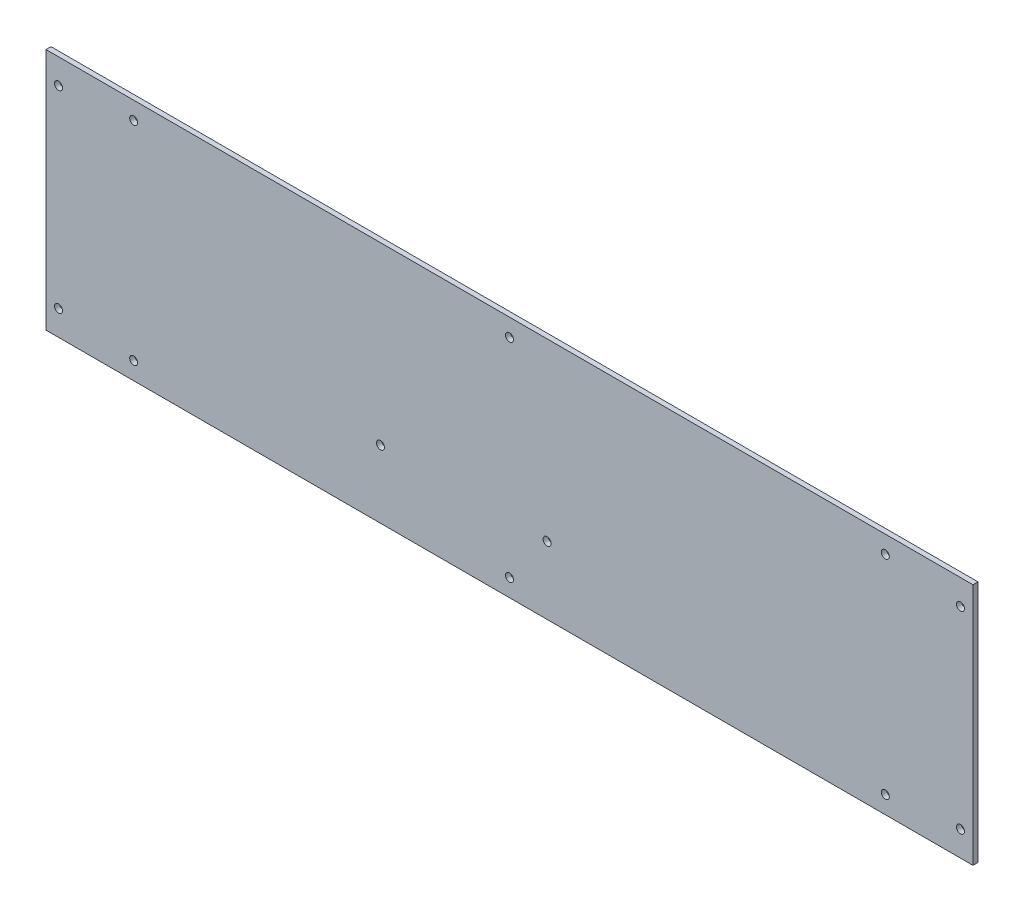
ISO-10303-21;
HEADER;
FILE_DESCRIPTION(('STEP AP214'),'2;1');
FILE_NAME('part.step','',(''),(''),'','','');
FILE_SCHEMA(('AUTOMOTIVE_DESIGN { 1 0 10303 214 1 1 1 1 }'));
ENDSEC;
DATA;
#1=APPLICATION_CONTEXT('core data for automotive mechanical design processes');
#2=APPLICATION_PROTOCOL_DEFINITION('international standard','automotive_design',2000,#1);
#3=PRODUCT_CONTEXT('',#1,'mechanical');
#4=PRODUCT('Part','Part','',(#3));
#5=PRODUCT_RELATED_PRODUCT_CATEGORY('part','',(#4));
#6=PRODUCT_DEFINITION_FORMATION('','',#4);
#7=PRODUCT_DEFINITION_CONTEXT('part definition',#1,'design');
#8=PRODUCT_DEFINITION('design','',#6,#7);
#9=PRODUCT_DEFINITION_SHAPE('','',#8);
#10=(LENGTH_UNIT() NAMED_UNIT(*) SI_UNIT(.MILLI.,.METRE.));
#11=(NAMED_UNIT(*) PLANE_ANGLE_UNIT() SI_UNIT($,.RADIAN.));
#12=(NAMED_UNIT(*) SI_UNIT($,.STERADIAN.) SOLID_ANGLE_UNIT());
#13=UNCERTAINTY_MEASURE_WITH_UNIT(LENGTH_MEASURE(1.E-05),#10,'distance_accuracy_value','');
#14=(GEOMETRIC_REPRESENTATION_CONTEXT(3) GLOBAL_UNCERTAINTY_ASSIGNED_CONTEXT((#13)) GLOBAL_UNIT_ASSIGNED_CONTEXT((#10,
#11,#12)) REPRESENTATION_CONTEXT('',''));
#15=CARTESIAN_POINT('',(0.,0.,0.));
#16=DIRECTION('',(0.,0.,1.));
#17=DIRECTION('',(1.,0.,0.));
#18=AXIS2_PLACEMENT_3D('',#15,#16,#17);
#19=CARTESIAN_POINT('',(0.,0.,-2.));
#20=DIRECTION('',(0.,-1.,0.));
#21=DIRECTION('',(0.,0.,-1.));
#22=AXIS2_PLACEMENT_3D('',#19,#20,#21);
#23=PLANE('',#22);
#24=DIRECTION('',(1.,0.,0.));
#25=VECTOR('',#24,1.);
#26=CARTESIAN_POINT('',(0.,0.,0.));
#27=LINE('',#26,#25);
#28=CARTESIAN_POINT('',(-370.,0.,0.));
#29=VERTEX_POINT('',#28);
#30=CARTESIAN_POINT('',(0.,0.,0.));
#31=VERTEX_POINT('',#30);
#32=EDGE_CURVE('E107',#29,#31,#27,.T.);
#33=ORIENTED_EDGE('',*,*,#32,.F.);
#34=DIRECTION('',(0.,0.,1.));
#35=VECTOR('',#34,1.);
#36=CARTESIAN_POINT('',(-370.,0.,-2.));
#37=LINE('',#36,#35);
#38=CARTESIAN_POINT('',(-370.,0.,-2.));
#39=VERTEX_POINT('',#38);
#40=EDGE_CURVE('E11',#39,#29,#37,.T.);
#41=ORIENTED_EDGE('',*,*,#40,.F.);
#42=DIRECTION('',(1.,0.,0.));
#43=VECTOR('',#42,1.);
#44=CARTESIAN_POINT('',(0.,0.,-2.));
#45=LINE('',#44,#43);
#46=CARTESIAN_POINT('',(0.,0.,-2.));
#47=VERTEX_POINT('',#46);
#48=EDGE_CURVE('E101',#39,#47,#45,.T.);
#49=ORIENTED_EDGE('',*,*,#48,.T.);
#50=DIRECTION('',(0.,0.,1.));
#51=VECTOR('',#50,1.);
#52=CARTESIAN_POINT('',(0.,0.,-2.));
#53=LINE('',#52,#51);
#54=EDGE_CURVE('E46',#47,#31,#53,.T.);
#55=ORIENTED_EDGE('',*,*,#54,.T.);
#56=EDGE_LOOP('',(#33,#41,#49,#55));
#57=FACE_BOUND('',#56,.T.);
#58=ADVANCED_FACE('F43',(#57),#23,.T.);
#59=CARTESIAN_POINT('',(-370.,0.,-2.));
#60=DIRECTION('',(-1.,0.,0.));
#61=DIRECTION('',(0.,0.,1.));
#62=AXIS2_PLACEMENT_3D('',#59,#60,#61);
#63=PLANE('',#62);
#64=DIRECTION('',(0.,-1.,0.));
#65=VECTOR('',#64,1.);
#66=CARTESIAN_POINT('',(-370.,0.,0.));
#67=LINE('',#66,#65);
#68=CARTESIAN_POINT('',(-370.,97.,0.));
#69=VERTEX_POINT('',#68);
#70=EDGE_CURVE('E103',#69,#29,#67,.T.);
#71=ORIENTED_EDGE('',*,*,#70,.F.);
#72=DIRECTION('',(0.,0.,1.));
#73=VECTOR('',#72,1.);
#74=CARTESIAN_POINT('',(-370.,97.,-2.));
#75=LINE('',#74,#73);
#76=CARTESIAN_POINT('',(-370.,97.,-2.));
#77=VERTEX_POINT('',#76);
#78=EDGE_CURVE('E55',#77,#69,#75,.T.);
#79=ORIENTED_EDGE('',*,*,#78,.F.);
#80=DIRECTION('',(0.,-1.,0.));
#81=VECTOR('',#80,1.);
#82=CARTESIAN_POINT('',(-370.,0.,-2.));
#83=LINE('',#82,#81);
#84=EDGE_CURVE('E98',#77,#39,#83,.T.);
#85=ORIENTED_EDGE('',*,*,#84,.T.);
#86=ORIENTED_EDGE('',*,*,#40,.T.);
#87=EDGE_LOOP('',(#71,#79,#85,#86));
#88=FACE_BOUND('',#87,.T.);
#89=ADVANCED_FACE('F116',(#88),#63,.T.);
#90=CARTESIAN_POINT('',(0.,97.,-2.));
#91=DIRECTION('',(0.,1.,0.));
#92=DIRECTION('',(0.,0.,1.));
#93=AXIS2_PLACEMENT_3D('',#90,#91,#92);
#94=PLANE('',#93);
#95=DIRECTION('',(-1.,0.,0.));
#96=VECTOR('',#95,1.);
#97=CARTESIAN_POINT('',(0.,97.,0.));
#98=LINE('',#97,#96);
#99=CARTESIAN_POINT('',(0.,97.,0.));
#100=VERTEX_POINT('',#99);
#101=EDGE_CURVE('E91',#100,#69,#98,.T.);
#102=ORIENTED_EDGE('',*,*,#101,.F.);
#103=DIRECTION('',(0.,0.,1.));
#104=VECTOR('',#103,1.);
#105=CARTESIAN_POINT('',(0.,97.,-2.));
#106=LINE('',#105,#104);
#107=CARTESIAN_POINT('',(0.,97.,-2.));
#108=VERTEX_POINT('',#107);
#109=EDGE_CURVE('E86',#108,#100,#106,.T.);
#110=ORIENTED_EDGE('',*,*,#109,.F.);
#111=DIRECTION('',(-1.,0.,0.));
#112=VECTOR('',#111,1.);
#113=CARTESIAN_POINT('',(0.,97.,-2.));
#114=LINE('',#113,#112);
#115=EDGE_CURVE('E93',#108,#77,#114,.T.);
#116=ORIENTED_EDGE('',*,*,#115,.T.);
#117=ORIENTED_EDGE('',*,*,#78,.T.);
#118=EDGE_LOOP('',(#102,#110,#116,#117));
#119=FACE_BOUND('',#118,.T.);
#120=ADVANCED_FACE('F89',(#119),#94,.T.);
#121=CARTESIAN_POINT('',(0.,0.,-2.));
#122=DIRECTION('',(1.,0.,0.));
#123=DIRECTION('',(0.,0.,-1.));
#124=AXIS2_PLACEMENT_3D('',#121,#122,#123);
#125=PLANE('',#124);
#126=DIRECTION('',(0.,1.,0.));
#127=VECTOR('',#126,1.);
#128=CARTESIAN_POINT('',(0.,0.,0.));
#129=LINE('',#128,#127);
#130=EDGE_CURVE('E112',#31,#100,#129,.T.);
#131=ORIENTED_EDGE('',*,*,#130,.F.);
#132=ORIENTED_EDGE('',*,*,#54,.F.);
#133=DIRECTION('',(0.,1.,0.));
#134=VECTOR('',#133,1.);
#135=CARTESIAN_POINT('',(0.,0.,-2.));
#136=LINE('',#135,#134);
#137=EDGE_CURVE('E100',#47,#108,#136,.T.);
#138=ORIENTED_EDGE('',*,*,#137,.T.);
#139=ORIENTED_EDGE('',*,*,#109,.T.);
#140=EDGE_LOOP('',(#131,#132,#138,#139));
#141=FACE_BOUND('',#140,.T.);
#142=ADVANCED_FACE('F99',(#141),#125,.T.);
#143=CARTESIAN_POINT('',(0.,0.,-2.));
#144=DIRECTION('',(0.,0.,-1.));
#145=DIRECTION('',(-1.,0.,0.));
#146=AXIS2_PLACEMENT_3D('',#143,#144,#145);
#147=PLANE('',#146);
#148=CARTESIAN_POINT('',(-35.,7.00000000000001,-2.));
#149=DIRECTION('',(0.,0.,1.));
#150=DIRECTION('',(1.,0.,0.));
#151=AXIS2_PLACEMENT_3D('',#148,#149,#150);
#152=CIRCLE('',#151,1.6);
#153=CARTESIAN_POINT('',(-33.4,7.00000000000001,-2.));
#154=VERTEX_POINT('',#153);
#155=EDGE_CURVE('E195',#154,#154,#152,.T.);
#156=ORIENTED_EDGE('',*,*,#155,.T.);
#157=EDGE_LOOP('',(#156));
#158=FACE_BOUND('',#157,.T.);
#159=CARTESIAN_POINT('',(-335.,7.00000000000001,-2.));
#160=DIRECTION('',(0.,0.,1.));
#161=DIRECTION('',(1.,0.,0.));
#162=AXIS2_PLACEMENT_3D('',#159,#160,#161);
#163=CIRCLE('',#162,1.59999999999999);
#164=CARTESIAN_POINT('',(-333.4,7.00000000000001,-2.));
#165=VERTEX_POINT('',#164);
#166=EDGE_CURVE('E199',#165,#165,#163,.T.);
#167=ORIENTED_EDGE('',*,*,#166,.T.);
#168=EDGE_LOOP('',(#167));
#169=FACE_BOUND('',#168,.T.);
#170=CARTESIAN_POINT('',(-185.,7.,-2.));
#171=DIRECTION('',(0.,0.,1.));
#172=DIRECTION('',(1.,0.,0.));
#173=AXIS2_PLACEMENT_3D('',#170,#171,#172);
#174=CIRCLE('',#173,1.59999999999999);
#175=CARTESIAN_POINT('',(-183.4,7.,-2.));
#176=VERTEX_POINT('',#175);
#177=EDGE_CURVE('E206',#176,#176,#174,.T.);
#178=ORIENTED_EDGE('',*,*,#177,.T.);
#179=EDGE_LOOP('',(#178));
#180=FACE_BOUND('',#179,.T.);
#181=CARTESIAN_POINT('',(-170.,27.,-2.));
#182=DIRECTION('',(0.,0.,1.));
#183=DIRECTION('',(1.,0.,0.));
#184=AXIS2_PLACEMENT_3D('',#181,#182,#183);
#185=CIRCLE('',#184,1.59999999999999);
#186=CARTESIAN_POINT('',(-168.4,27.,-2.));
#187=VERTEX_POINT('',#186);
#188=EDGE_CURVE('E215',#187,#187,#185,.T.);
#189=ORIENTED_EDGE('',*,*,#188,.T.);
#190=EDGE_LOOP('',(#189));
#191=FACE_BOUND('',#190,.T.);
#192=CARTESIAN_POINT('',(-236.5,27.,-2.));
#193=DIRECTION('',(0.,0.,1.));
#194=DIRECTION('',(1.,0.,0.));
#195=AXIS2_PLACEMENT_3D('',#192,#193,#194);
#196=CIRCLE('',#195,1.59999999999999);
#197=CARTESIAN_POINT('',(-234.9,27.,-2.));
#198=VERTEX_POINT('',#197);
#199=EDGE_CURVE('E217',#198,#198,#196,.T.);
#200=ORIENTED_EDGE('',*,*,#199,.T.);
#201=EDGE_LOOP('',(#200));
#202=FACE_BOUND('',#201,.T.);
#203=CARTESIAN_POINT('',(-185.,90.,-2.));
#204=DIRECTION('',(0.,0.,1.));
#205=DIRECTION('',(1.,0.,0.));
#206=AXIS2_PLACEMENT_3D('',#203,#204,#205);
#207=CIRCLE('',#206,1.6);
#208=CARTESIAN_POINT('',(-183.4,90.,-2.));
#209=VERTEX_POINT('',#208);
#210=EDGE_CURVE('E221',#209,#209,#207,.T.);
#211=ORIENTED_EDGE('',*,*,#210,.T.);
#212=EDGE_LOOP('',(#211));
#213=FACE_BOUND('',#212,.T.);
#214=CARTESIAN_POINT('',(-335.,90.,-2.));
#215=DIRECTION('',(0.,0.,1.));
#216=DIRECTION('',(1.,0.,0.));
#217=AXIS2_PLACEMENT_3D('',#214,#215,#216);
#218=CIRCLE('',#217,1.6);
#219=CARTESIAN_POINT('',(-333.4,90.,-2.));
#220=VERTEX_POINT('',#219);
#221=EDGE_CURVE('E228',#220,#220,#218,.T.);
#222=ORIENTED_EDGE('',*,*,#221,.T.);
#223=EDGE_LOOP('',(#222));
#224=FACE_BOUND('',#223,.T.);
#225=CARTESIAN_POINT('',(-35.,90.,-2.));
#226=DIRECTION('',(0.,0.,1.));
#227=DIRECTION('',(1.,0.,0.));
#228=AXIS2_PLACEMENT_3D('',#225,#226,#227);
#229=CIRCLE('',#228,1.60000000000001);
#230=CARTESIAN_POINT('',(-33.4,90.,-2.));
#231=VERTEX_POINT('',#230);
#232=EDGE_CURVE('E237',#231,#231,#229,.T.);
#233=ORIENTED_EDGE('',*,*,#232,.T.);
#234=EDGE_LOOP('',(#233));
#235=FACE_BOUND('',#234,.T.);
#236=CARTESIAN_POINT('',(-365.,87.,-2.));
#237=DIRECTION('',(0.,0.,1.));
#238=DIRECTION('',(1.,0.,0.));
#239=AXIS2_PLACEMENT_3D('',#236,#237,#238);
#240=CIRCLE('',#239,1.59999999999999);
#241=CARTESIAN_POINT('',(-363.4,87.,-2.));
#242=VERTEX_POINT('',#241);
#243=EDGE_CURVE('E245',#242,#242,#240,.T.);
#244=ORIENTED_EDGE('',*,*,#243,.T.);
#245=EDGE_LOOP('',(#244));
#246=FACE_BOUND('',#245,.T.);
#247=CARTESIAN_POINT('',(-365.,10.,-2.));
#248=DIRECTION('',(0.,0.,1.));
#249=DIRECTION('',(1.,0.,0.));
#250=AXIS2_PLACEMENT_3D('',#247,#248,#249);
#251=CIRCLE('',#250,1.59999999999999);
#252=CARTESIAN_POINT('',(-363.4,10.,-2.));
#253=VERTEX_POINT('',#252);
#254=EDGE_CURVE('E248',#253,#253,#251,.T.);
#255=ORIENTED_EDGE('',*,*,#254,.T.);
#256=EDGE_LOOP('',(#255));
#257=FACE_BOUND('',#256,.T.);
#258=CARTESIAN_POINT('',(-5.,87.,-2.));
#259=DIRECTION('',(0.,0.,1.));
#260=DIRECTION('',(1.,0.,0.));
#261=AXIS2_PLACEMENT_3D('',#258,#259,#260);
#262=CIRCLE('',#261,1.59999999999999);
#263=CARTESIAN_POINT('',(-3.40000000000001,87.,-2.));
#264=VERTEX_POINT('',#263);
#265=EDGE_CURVE('E255',#264,#264,#262,.T.);
#266=ORIENTED_EDGE('',*,*,#265,.T.);
#267=EDGE_LOOP('',(#266));
#268=FACE_BOUND('',#267,.T.);
#269=CARTESIAN_POINT('',(-5.,9.99999999999999,-2.));
#270=DIRECTION('',(0.,0.,1.));
#271=DIRECTION('',(1.,0.,0.));
#272=AXIS2_PLACEMENT_3D('',#269,#270,#271);
#273=CIRCLE('',#272,1.6);
#274=CARTESIAN_POINT('',(-3.4,9.99999999999999,-2.));
#275=VERTEX_POINT('',#274);
#276=EDGE_CURVE('E115',#275,#275,#273,.T.);
#277=ORIENTED_EDGE('',*,*,#276,.T.);
#278=EDGE_LOOP('',(#277));
#279=FACE_BOUND('',#278,.T.);
#280=ORIENTED_EDGE('',*,*,#48,.F.);
#281=ORIENTED_EDGE('',*,*,#84,.F.);
#282=ORIENTED_EDGE('',*,*,#115,.F.);
#283=ORIENTED_EDGE('',*,*,#137,.F.);
#284=EDGE_LOOP('',(#280,#281,#282,#283));
#285=FACE_BOUND('',#284,.T.);
#286=ADVANCED_FACE('F96',(#158,#169,#180,#191,#202,#213,#224,#235,#246,#257,#268,#279,#285),
#147,.T.);
#287=CARTESIAN_POINT('',(0.,0.,0.));
#288=DIRECTION('',(0.,0.,-1.));
#289=DIRECTION('',(-1.,0.,0.));
#290=AXIS2_PLACEMENT_3D('',#287,#288,#289);
#291=PLANE('',#290);
#292=CARTESIAN_POINT('',(-35.,7.00000000000001,0.));
#293=DIRECTION('',(0.,0.,1.));
#294=DIRECTION('',(1.,0.,0.));
#295=AXIS2_PLACEMENT_3D('',#292,#293,#294);
#296=CIRCLE('',#295,1.6);
#297=CARTESIAN_POINT('',(-33.4,7.00000000000001,0.));
#298=VERTEX_POINT('',#297);
#299=EDGE_CURVE('E194',#298,#298,#296,.T.);
#300=ORIENTED_EDGE('',*,*,#299,.F.);
#301=EDGE_LOOP('',(#300));
#302=FACE_BOUND('',#301,.T.);
#303=CARTESIAN_POINT('',(-335.,7.00000000000001,0.));
#304=DIRECTION('',(0.,0.,1.));
#305=DIRECTION('',(1.,0.,0.));
#306=AXIS2_PLACEMENT_3D('',#303,#304,#305);
#307=CIRCLE('',#306,1.59999999999999);
#308=CARTESIAN_POINT('',(-333.4,7.00000000000001,0.));
#309=VERTEX_POINT('',#308);
#310=EDGE_CURVE('E197',#309,#309,#307,.T.);
#311=ORIENTED_EDGE('',*,*,#310,.F.);
#312=EDGE_LOOP('',(#311));
#313=FACE_BOUND('',#312,.T.);
#314=CARTESIAN_POINT('',(-185.,7.,0.));
#315=DIRECTION('',(0.,0.,1.));
#316=DIRECTION('',(1.,0.,0.));
#317=AXIS2_PLACEMENT_3D('',#314,#315,#316);
#318=CIRCLE('',#317,1.59999999999999);
#319=CARTESIAN_POINT('',(-183.4,7.,0.));
#320=VERTEX_POINT('',#319);
#321=EDGE_CURVE('E201',#320,#320,#318,.T.);
#322=ORIENTED_EDGE('',*,*,#321,.F.);
#323=EDGE_LOOP('',(#322));
#324=FACE_BOUND('',#323,.T.);
#325=CARTESIAN_POINT('',(-170.,27.,0.));
#326=DIRECTION('',(0.,0.,1.));
#327=DIRECTION('',(1.,0.,0.));
#328=AXIS2_PLACEMENT_3D('',#325,#326,#327);
#329=CIRCLE('',#328,1.59999999999999);
#330=CARTESIAN_POINT('',(-168.4,27.,0.));
#331=VERTEX_POINT('',#330);
#332=EDGE_CURVE('E207',#331,#331,#329,.T.);
#333=ORIENTED_EDGE('',*,*,#332,.F.);
#334=EDGE_LOOP('',(#333));
#335=FACE_BOUND('',#334,.T.);
#336=CARTESIAN_POINT('',(-236.5,27.,0.));
#337=DIRECTION('',(0.,0.,1.));
#338=DIRECTION('',(1.,0.,0.));
#339=AXIS2_PLACEMENT_3D('',#336,#337,#338);
#340=CIRCLE('',#339,1.59999999999999);
#341=CARTESIAN_POINT('',(-234.9,27.,0.));
#342=VERTEX_POINT('',#341);
#343=EDGE_CURVE('E214',#342,#342,#340,.T.);
#344=ORIENTED_EDGE('',*,*,#343,.F.);
#345=EDGE_LOOP('',(#344));
#346=FACE_BOUND('',#345,.T.);
#347=CARTESIAN_POINT('',(-185.,90.,0.));
#348=DIRECTION('',(0.,0.,1.));
#349=DIRECTION('',(1.,0.,0.));
#350=AXIS2_PLACEMENT_3D('',#347,#348,#349);
#351=CIRCLE('',#350,1.6);
#352=CARTESIAN_POINT('',(-183.4,90.,0.));
#353=VERTEX_POINT('',#352);
#354=EDGE_CURVE('E222',#353,#353,#351,.T.);
#355=ORIENTED_EDGE('',*,*,#354,.F.);
#356=EDGE_LOOP('',(#355));
#357=FACE_BOUND('',#356,.T.);
#358=CARTESIAN_POINT('',(-335.,90.,0.));
#359=DIRECTION('',(0.,0.,1.));
#360=DIRECTION('',(1.,0.,0.));
#361=AXIS2_PLACEMENT_3D('',#358,#359,#360);
#362=CIRCLE('',#361,1.6);
#363=CARTESIAN_POINT('',(-333.4,90.,0.));
#364=VERTEX_POINT('',#363);
#365=EDGE_CURVE('E230',#364,#364,#362,.T.);
#366=ORIENTED_EDGE('',*,*,#365,.F.);
#367=EDGE_LOOP('',(#366));
#368=FACE_BOUND('',#367,.T.);
#369=CARTESIAN_POINT('',(-35.,90.,0.));
#370=DIRECTION('',(0.,0.,1.));
#371=DIRECTION('',(1.,0.,0.));
#372=AXIS2_PLACEMENT_3D('',#369,#370,#371);
#373=CIRCLE('',#372,1.60000000000001);
#374=CARTESIAN_POINT('',(-33.4,90.,0.));
#375=VERTEX_POINT('',#374);
#376=EDGE_CURVE('E235',#375,#375,#373,.T.);
#377=ORIENTED_EDGE('',*,*,#376,.F.);
#378=EDGE_LOOP('',(#377));
#379=FACE_BOUND('',#378,.T.);
#380=CARTESIAN_POINT('',(-365.,87.,0.));
#381=DIRECTION('',(0.,0.,1.));
#382=DIRECTION('',(1.,0.,0.));
#383=AXIS2_PLACEMENT_3D('',#380,#381,#382);
#384=CIRCLE('',#383,1.59999999999999);
#385=CARTESIAN_POINT('',(-363.4,87.,0.));
#386=VERTEX_POINT('',#385);
#387=EDGE_CURVE('E239',#386,#386,#384,.T.);
#388=ORIENTED_EDGE('',*,*,#387,.F.);
#389=EDGE_LOOP('',(#388));
#390=FACE_BOUND('',#389,.T.);
#391=CARTESIAN_POINT('',(-365.,10.,0.));
#392=DIRECTION('',(0.,0.,1.));
#393=DIRECTION('',(1.,0.,0.));
#394=AXIS2_PLACEMENT_3D('',#391,#392,#393);
#395=CIRCLE('',#394,1.59999999999999);
#396=CARTESIAN_POINT('',(-363.4,10.,0.));
#397=VERTEX_POINT('',#396);
#398=EDGE_CURVE('E243',#397,#397,#395,.T.);
#399=ORIENTED_EDGE('',*,*,#398,.F.);
#400=EDGE_LOOP('',(#399));
#401=FACE_BOUND('',#400,.T.);
#402=CARTESIAN_POINT('',(-5.,87.,0.));
#403=DIRECTION('',(0.,0.,1.));
#404=DIRECTION('',(1.,0.,0.));
#405=AXIS2_PLACEMENT_3D('',#402,#403,#404);
#406=CIRCLE('',#405,1.59999999999999);
#407=CARTESIAN_POINT('',(-3.40000000000001,87.,0.));
#408=VERTEX_POINT('',#407);
#409=EDGE_CURVE('E253',#408,#408,#406,.T.);
#410=ORIENTED_EDGE('',*,*,#409,.F.);
#411=EDGE_LOOP('',(#410));
#412=FACE_BOUND('',#411,.T.);
#413=CARTESIAN_POINT('',(-5.,9.99999999999999,0.));
#414=DIRECTION('',(0.,0.,1.));
#415=DIRECTION('',(1.,0.,0.));
#416=AXIS2_PLACEMENT_3D('',#413,#414,#415);
#417=CIRCLE('',#416,1.6);
#418=CARTESIAN_POINT('',(-3.4,9.99999999999999,0.));
#419=VERTEX_POINT('',#418);
#420=EDGE_CURVE('E260',#419,#419,#417,.T.);
#421=ORIENTED_EDGE('',*,*,#420,.F.);
#422=EDGE_LOOP('',(#421));
#423=FACE_BOUND('',#422,.T.);
#424=ORIENTED_EDGE('',*,*,#32,.T.);
#425=ORIENTED_EDGE('',*,*,#130,.T.);
#426=ORIENTED_EDGE('',*,*,#101,.T.);
#427=ORIENTED_EDGE('',*,*,#70,.T.);
#428=EDGE_LOOP('',(#424,#425,#426,#427));
#429=FACE_BOUND('',#428,.T.);
#430=ADVANCED_FACE('F119',(#302,#313,#324,#335,#346,#357,#368,#379,#390,#401,#412,#423,#429),
#291,.F.);
#431=CARTESIAN_POINT('',(-5.,9.99999999999999,-2.));
#432=DIRECTION('',(0.,0.,1.));
#433=DIRECTION('',(1.,0.,0.));
#434=AXIS2_PLACEMENT_3D('',#431,#432,#433);
#435=CYLINDRICAL_SURFACE('',#434,1.6);
#436=ORIENTED_EDGE('',*,*,#276,.F.);
#437=EDGE_LOOP('',(#436));
#438=FACE_BOUND('',#437,.T.);
#439=ORIENTED_EDGE('',*,*,#420,.T.);
#440=EDGE_LOOP('',(#439));
#441=FACE_BOUND('',#440,.T.);
#442=ADVANCED_FACE('F140',(#438,#441),#435,.F.);
#443=CARTESIAN_POINT('',(-5.,87.,-2.));
#444=DIRECTION('',(0.,0.,1.));
#445=DIRECTION('',(1.,0.,0.));
#446=AXIS2_PLACEMENT_3D('',#443,#444,#445);
#447=CYLINDRICAL_SURFACE('',#446,1.59999999999999);
#448=ORIENTED_EDGE('',*,*,#265,.F.);
#449=EDGE_LOOP('',(#448));
#450=FACE_BOUND('',#449,.T.);
#451=ORIENTED_EDGE('',*,*,#409,.T.);
#452=EDGE_LOOP('',(#451));
#453=FACE_BOUND('',#452,.T.);
#454=ADVANCED_FACE('F145',(#450,#453),#447,.F.);
#455=CARTESIAN_POINT('',(-365.,10.,-2.));
#456=DIRECTION('',(0.,0.,1.));
#457=DIRECTION('',(1.,0.,0.));
#458=AXIS2_PLACEMENT_3D('',#455,#456,#457);
#459=CYLINDRICAL_SURFACE('',#458,1.59999999999999);
#460=ORIENTED_EDGE('',*,*,#254,.F.);
#461=EDGE_LOOP('',(#460));
#462=FACE_BOUND('',#461,.T.);
#463=ORIENTED_EDGE('',*,*,#398,.T.);
#464=EDGE_LOOP('',(#463));
#465=FACE_BOUND('',#464,.T.);
#466=ADVANCED_FACE('F146',(#462,#465),#459,.F.);
#467=CARTESIAN_POINT('',(-365.,87.,-2.));
#468=DIRECTION('',(0.,0.,1.));
#469=DIRECTION('',(1.,0.,0.));
#470=AXIS2_PLACEMENT_3D('',#467,#468,#469);
#471=CYLINDRICAL_SURFACE('',#470,1.59999999999999);
#472=ORIENTED_EDGE('',*,*,#243,.F.);
#473=EDGE_LOOP('',(#472));
#474=FACE_BOUND('',#473,.T.);
#475=ORIENTED_EDGE('',*,*,#387,.T.);
#476=EDGE_LOOP('',(#475));
#477=FACE_BOUND('',#476,.T.);
#478=ADVANCED_FACE('F155',(#474,#477),#471,.F.);
#479=CARTESIAN_POINT('',(-35.,90.,-2.));
#480=DIRECTION('',(0.,0.,1.));
#481=DIRECTION('',(1.,0.,0.));
#482=AXIS2_PLACEMENT_3D('',#479,#480,#481);
#483=CYLINDRICAL_SURFACE('',#482,1.60000000000001);
#484=ORIENTED_EDGE('',*,*,#232,.F.);
#485=EDGE_LOOP('',(#484));
#486=FACE_BOUND('',#485,.T.);
#487=ORIENTED_EDGE('',*,*,#376,.T.);
#488=EDGE_LOOP('',(#487));
#489=FACE_BOUND('',#488,.T.);
#490=ADVANCED_FACE('F156',(#486,#489),#483,.F.);
#491=CARTESIAN_POINT('',(-335.,90.,-2.));
#492=DIRECTION('',(0.,0.,1.));
#493=DIRECTION('',(1.,0.,0.));
#494=AXIS2_PLACEMENT_3D('',#491,#492,#493);
#495=CYLINDRICAL_SURFACE('',#494,1.6);
#496=ORIENTED_EDGE('',*,*,#221,.F.);
#497=EDGE_LOOP('',(#496));
#498=FACE_BOUND('',#497,.T.);
#499=ORIENTED_EDGE('',*,*,#365,.T.);
#500=EDGE_LOOP('',(#499));
#501=FACE_BOUND('',#500,.T.);
#502=ADVANCED_FACE('F159',(#498,#501),#495,.F.);
#503=CARTESIAN_POINT('',(-185.,90.,-2.));
#504=DIRECTION('',(0.,0.,1.));
#505=DIRECTION('',(1.,0.,0.));
#506=AXIS2_PLACEMENT_3D('',#503,#504,#505);
#507=CYLINDRICAL_SURFACE('',#506,1.6);
#508=ORIENTED_EDGE('',*,*,#210,.F.);
#509=EDGE_LOOP('',(#508));
#510=FACE_BOUND('',#509,.T.);
#511=ORIENTED_EDGE('',*,*,#354,.T.);
#512=EDGE_LOOP('',(#511));
#513=FACE_BOUND('',#512,.T.);
#514=ADVANCED_FACE('F163',(#510,#513),#507,.F.);
#515=CARTESIAN_POINT('',(-236.5,27.,-2.));
#516=DIRECTION('',(0.,0.,1.));
#517=DIRECTION('',(1.,0.,0.));
#518=AXIS2_PLACEMENT_3D('',#515,#516,#517);
#519=CYLINDRICAL_SURFACE('',#518,1.59999999999999);
#520=ORIENTED_EDGE('',*,*,#199,.F.);
#521=EDGE_LOOP('',(#520));
#522=FACE_BOUND('',#521,.T.);
#523=ORIENTED_EDGE('',*,*,#343,.T.);
#524=EDGE_LOOP('',(#523));
#525=FACE_BOUND('',#524,.T.);
#526=ADVANCED_FACE('F169',(#522,#525),#519,.F.);
#527=CARTESIAN_POINT('',(-170.,27.,-2.));
#528=DIRECTION('',(0.,0.,1.));
#529=DIRECTION('',(1.,0.,0.));
#530=AXIS2_PLACEMENT_3D('',#527,#528,#529);
#531=CYLINDRICAL_SURFACE('',#530,1.59999999999999);
#532=ORIENTED_EDGE('',*,*,#188,.F.);
#533=EDGE_LOOP('',(#532));
#534=FACE_BOUND('',#533,.T.);
#535=ORIENTED_EDGE('',*,*,#332,.T.);
#536=EDGE_LOOP('',(#535));
#537=FACE_BOUND('',#536,.T.);
#538=ADVANCED_FACE('F175',(#534,#537),#531,.F.);
#539=CARTESIAN_POINT('',(-185.,7.,-2.));
#540=DIRECTION('',(0.,0.,1.));
#541=DIRECTION('',(1.,0.,0.));
#542=AXIS2_PLACEMENT_3D('',#539,#540,#541);
#543=CYLINDRICAL_SURFACE('',#542,1.59999999999999);
#544=ORIENTED_EDGE('',*,*,#177,.F.);
#545=EDGE_LOOP('',(#544));
#546=FACE_BOUND('',#545,.T.);
#547=ORIENTED_EDGE('',*,*,#321,.T.);
#548=EDGE_LOOP('',(#547));
#549=FACE_BOUND('',#548,.T.);
#550=ADVANCED_FACE('F179',(#546,#549),#543,.F.);
#551=CARTESIAN_POINT('',(-335.,7.00000000000001,-2.));
#552=DIRECTION('',(0.,0.,1.));
#553=DIRECTION('',(1.,0.,0.));
#554=AXIS2_PLACEMENT_3D('',#551,#552,#553);
#555=CYLINDRICAL_SURFACE('',#554,1.59999999999999);
#556=ORIENTED_EDGE('',*,*,#166,.F.);
#557=EDGE_LOOP('',(#556));
#558=FACE_BOUND('',#557,.T.);
#559=ORIENTED_EDGE('',*,*,#310,.T.);
#560=EDGE_LOOP('',(#559));
#561=FACE_BOUND('',#560,.T.);
#562=ADVANCED_FACE('F177',(#558,#561),#555,.F.);
#563=CARTESIAN_POINT('',(-35.,7.00000000000001,-2.));
#564=DIRECTION('',(0.,0.,1.));
#565=DIRECTION('',(1.,0.,0.));
#566=AXIS2_PLACEMENT_3D('',#563,#564,#565);
#567=CYLINDRICAL_SURFACE('',#566,1.6);
#568=ORIENTED_EDGE('',*,*,#155,.F.);
#569=EDGE_LOOP('',(#568));
#570=FACE_BOUND('',#569,.T.);
#571=ORIENTED_EDGE('',*,*,#299,.T.);
#572=EDGE_LOOP('',(#571));
#573=FACE_BOUND('',#572,.T.);
#574=ADVANCED_FACE('F184',(#570,#573),#567,.F.);
#575=CLOSED_SHELL('',(#58,#89,#120,#142,#286,#430,#442,#454,#466,#478,#490,#502,#514,#526,#538,
#550,#562,#574));
#576=MANIFOLD_SOLID_BREP('B2',#575);
#577=ADVANCED_BREP_SHAPE_REPRESENTATION('',(#18,#576),#14);
#578=SHAPE_DEFINITION_REPRESENTATION(#9,#577);
ENDSEC;
END-ISO-10303-21;
